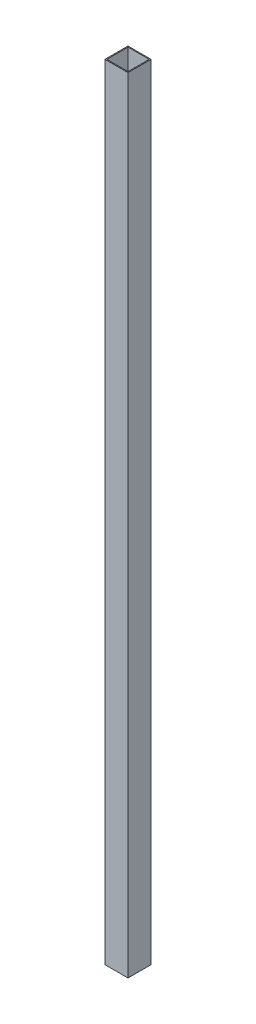
ISO-10303-21;
HEADER;
FILE_DESCRIPTION(('STEP AP214'),'2;1');
FILE_NAME('part.step','',(''),(''),'','','');
FILE_SCHEMA(('AUTOMOTIVE_DESIGN { 1 0 10303 214 1 1 1 1 }'));
ENDSEC;
DATA;
#1=APPLICATION_CONTEXT('core data for automotive mechanical design processes');
#2=APPLICATION_PROTOCOL_DEFINITION('international standard','automotive_design',2000,#1);
#3=PRODUCT_CONTEXT('',#1,'mechanical');
#4=PRODUCT('Part','Part','',(#3));
#5=PRODUCT_RELATED_PRODUCT_CATEGORY('part','',(#4));
#6=PRODUCT_DEFINITION_FORMATION('','',#4);
#7=PRODUCT_DEFINITION_CONTEXT('part definition',#1,'design');
#8=PRODUCT_DEFINITION('design','',#6,#7);
#9=PRODUCT_DEFINITION_SHAPE('','',#8);
#10=(LENGTH_UNIT() NAMED_UNIT(*) SI_UNIT(.MILLI.,.METRE.));
#11=(NAMED_UNIT(*) PLANE_ANGLE_UNIT() SI_UNIT($,.RADIAN.));
#12=(NAMED_UNIT(*) SI_UNIT($,.STERADIAN.) SOLID_ANGLE_UNIT());
#13=UNCERTAINTY_MEASURE_WITH_UNIT(LENGTH_MEASURE(1.E-05),#10,'distance_accuracy_value','');
#14=(GEOMETRIC_REPRESENTATION_CONTEXT(3) GLOBAL_UNCERTAINTY_ASSIGNED_CONTEXT((#13)) GLOBAL_UNIT_ASSIGNED_CONTEXT((#10,
#11,#12)) REPRESENTATION_CONTEXT('',''));
#15=CARTESIAN_POINT('',(0.,0.,0.));
#16=DIRECTION('',(0.,0.,1.));
#17=DIRECTION('',(1.,0.,0.));
#18=AXIS2_PLACEMENT_3D('',#15,#16,#17);
#19=CARTESIAN_POINT('',(0.,1700.,0.));
#20=DIRECTION('',(0.,-1.,0.));
#21=DIRECTION('',(0.,0.,-1.));
#22=AXIS2_PLACEMENT_3D('',#19,#20,#21);
#23=PLANE('',#22);
#24=DIRECTION('',(0.,0.,-1.));
#25=VECTOR('',#24,1.);
#26=CARTESIAN_POINT('',(25.,1700.,25.));
#27=LINE('',#26,#25);
#28=CARTESIAN_POINT('',(25.,1700.,25.));
#29=VERTEX_POINT('',#28);
#30=CARTESIAN_POINT('',(25.,1700.,-25.));
#31=VERTEX_POINT('',#30);
#32=EDGE_CURVE('E153',#29,#31,#27,.T.);
#33=ORIENTED_EDGE('',*,*,#32,.T.);
#34=DIRECTION('',(-1.,0.,0.));
#35=VECTOR('',#34,1.);
#36=CARTESIAN_POINT('',(-25.,1700.,-25.));
#37=LINE('',#36,#35);
#38=CARTESIAN_POINT('',(-25.,1700.,-25.));
#39=VERTEX_POINT('',#38);
#40=EDGE_CURVE('E157',#31,#39,#37,.T.);
#41=ORIENTED_EDGE('',*,*,#40,.T.);
#42=DIRECTION('',(0.,0.,1.));
#43=VECTOR('',#42,1.);
#44=CARTESIAN_POINT('',(-25.,1700.,25.));
#45=LINE('',#44,#43);
#46=CARTESIAN_POINT('',(-25.,1700.,25.));
#47=VERTEX_POINT('',#46);
#48=EDGE_CURVE('E161',#39,#47,#45,.T.);
#49=ORIENTED_EDGE('',*,*,#48,.T.);
#50=DIRECTION('',(1.,0.,0.));
#51=VECTOR('',#50,1.);
#52=CARTESIAN_POINT('',(-25.,1700.,25.));
#53=LINE('',#52,#51);
#54=EDGE_CURVE('E164',#47,#29,#53,.T.);
#55=ORIENTED_EDGE('',*,*,#54,.T.);
#56=EDGE_LOOP('',(#33,#41,#49,#55));
#57=FACE_BOUND('',#56,.T.);
#58=DIRECTION('',(0.,0.,1.));
#59=VECTOR('',#58,1.);
#60=CARTESIAN_POINT('',(-23.,1700.,23.));
#61=LINE('',#60,#59);
#62=CARTESIAN_POINT('',(-23.,1700.,-23.));
#63=VERTEX_POINT('',#62);
#64=CARTESIAN_POINT('',(-23.,1700.,23.));
#65=VERTEX_POINT('',#64);
#66=EDGE_CURVE('E105',#63,#65,#61,.T.);
#67=ORIENTED_EDGE('',*,*,#66,.F.);
#68=DIRECTION('',(-1.,0.,0.));
#69=VECTOR('',#68,1.);
#70=CARTESIAN_POINT('',(-23.,1700.,-23.));
#71=LINE('',#70,#69);
#72=CARTESIAN_POINT('',(23.,1700.,-23.));
#73=VERTEX_POINT('',#72);
#74=EDGE_CURVE('E131',#73,#63,#71,.T.);
#75=ORIENTED_EDGE('',*,*,#74,.F.);
#76=DIRECTION('',(0.,0.,-1.));
#77=VECTOR('',#76,1.);
#78=CARTESIAN_POINT('',(23.,1700.,23.));
#79=LINE('',#78,#77);
#80=CARTESIAN_POINT('',(23.,1700.,23.));
#81=VERTEX_POINT('',#80);
#82=EDGE_CURVE('E127',#81,#73,#79,.T.);
#83=ORIENTED_EDGE('',*,*,#82,.F.);
#84=DIRECTION('',(1.,0.,0.));
#85=VECTOR('',#84,1.);
#86=CARTESIAN_POINT('',(-23.,1700.,23.));
#87=LINE('',#86,#85);
#88=EDGE_CURVE('E114',#65,#81,#87,.T.);
#89=ORIENTED_EDGE('',*,*,#88,.F.);
#90=EDGE_LOOP('',(#67,#75,#83,#89));
#91=FACE_BOUND('',#90,.T.);
#92=ADVANCED_FACE('F39',(#57,#91),#23,.F.);
#93=CARTESIAN_POINT('',(0.,0.,0.));
#94=DIRECTION('',(0.,-1.,0.));
#95=DIRECTION('',(0.,0.,-1.));
#96=AXIS2_PLACEMENT_3D('',#93,#94,#95);
#97=PLANE('',#96);
#98=DIRECTION('',(0.,0.,-1.));
#99=VECTOR('',#98,1.);
#100=CARTESIAN_POINT('',(25.,0.,25.));
#101=LINE('',#100,#99);
#102=CARTESIAN_POINT('',(25.,0.,25.));
#103=VERTEX_POINT('',#102);
#104=CARTESIAN_POINT('',(25.,0.,-25.));
#105=VERTEX_POINT('',#104);
#106=EDGE_CURVE('E123',#103,#105,#101,.T.);
#107=ORIENTED_EDGE('',*,*,#106,.F.);
#108=DIRECTION('',(1.,0.,0.));
#109=VECTOR('',#108,1.);
#110=CARTESIAN_POINT('',(-25.,0.,25.));
#111=LINE('',#110,#109);
#112=CARTESIAN_POINT('',(-25.,0.,25.));
#113=VERTEX_POINT('',#112);
#114=EDGE_CURVE('E158',#113,#103,#111,.T.);
#115=ORIENTED_EDGE('',*,*,#114,.F.);
#116=DIRECTION('',(0.,0.,1.));
#117=VECTOR('',#116,1.);
#118=CARTESIAN_POINT('',(-25.,0.,25.));
#119=LINE('',#118,#117);
#120=CARTESIAN_POINT('',(-25.,0.,-25.));
#121=VERTEX_POINT('',#120);
#122=EDGE_CURVE('E174',#121,#113,#119,.T.);
#123=ORIENTED_EDGE('',*,*,#122,.F.);
#124=DIRECTION('',(-1.,0.,0.));
#125=VECTOR('',#124,1.);
#126=CARTESIAN_POINT('',(-25.,0.,-25.));
#127=LINE('',#126,#125);
#128=EDGE_CURVE('E171',#105,#121,#127,.T.);
#129=ORIENTED_EDGE('',*,*,#128,.F.);
#130=EDGE_LOOP('',(#107,#115,#123,#129));
#131=FACE_BOUND('',#130,.T.);
#132=DIRECTION('',(-1.,0.,0.));
#133=VECTOR('',#132,1.);
#134=CARTESIAN_POINT('',(-23.,0.,-23.));
#135=LINE('',#134,#133);
#136=CARTESIAN_POINT('',(23.,0.,-23.));
#137=VERTEX_POINT('',#136);
#138=CARTESIAN_POINT('',(-23.,0.,-23.));
#139=VERTEX_POINT('',#138);
#140=EDGE_CURVE('E115',#137,#139,#135,.T.);
#141=ORIENTED_EDGE('',*,*,#140,.T.);
#142=DIRECTION('',(0.,0.,1.));
#143=VECTOR('',#142,1.);
#144=CARTESIAN_POINT('',(-23.,0.,23.));
#145=LINE('',#144,#143);
#146=CARTESIAN_POINT('',(-23.,0.,23.));
#147=VERTEX_POINT('',#146);
#148=EDGE_CURVE('E63',#139,#147,#145,.T.);
#149=ORIENTED_EDGE('',*,*,#148,.T.);
#150=DIRECTION('',(1.,0.,0.));
#151=VECTOR('',#150,1.);
#152=CARTESIAN_POINT('',(-23.,0.,23.));
#153=LINE('',#152,#151);
#154=CARTESIAN_POINT('',(23.,0.,23.));
#155=VERTEX_POINT('',#154);
#156=EDGE_CURVE('E121',#147,#155,#153,.T.);
#157=ORIENTED_EDGE('',*,*,#156,.T.);
#158=DIRECTION('',(0.,0.,-1.));
#159=VECTOR('',#158,1.);
#160=CARTESIAN_POINT('',(23.,0.,23.));
#161=LINE('',#160,#159);
#162=EDGE_CURVE('E140',#155,#137,#161,.T.);
#163=ORIENTED_EDGE('',*,*,#162,.T.);
#164=EDGE_LOOP('',(#141,#149,#157,#163));
#165=FACE_BOUND('',#164,.T.);
#166=ADVANCED_FACE('F197',(#131,#165),#97,.T.);
#167=CARTESIAN_POINT('',(25.,1700.,25.));
#168=DIRECTION('',(-1.,0.,0.));
#169=DIRECTION('',(0.,0.,1.));
#170=AXIS2_PLACEMENT_3D('',#167,#168,#169);
#171=PLANE('',#170);
#172=ORIENTED_EDGE('',*,*,#106,.T.);
#173=DIRECTION('',(0.,-1.,0.));
#174=VECTOR('',#173,1.);
#175=CARTESIAN_POINT('',(25.,1700.,-25.));
#176=LINE('',#175,#174);
#177=EDGE_CURVE('E11',#31,#105,#176,.T.);
#178=ORIENTED_EDGE('',*,*,#177,.F.);
#179=ORIENTED_EDGE('',*,*,#32,.F.);
#180=DIRECTION('',(0.,-1.,0.));
#181=VECTOR('',#180,1.);
#182=CARTESIAN_POINT('',(25.,1700.,25.));
#183=LINE('',#182,#181);
#184=EDGE_CURVE('E167',#29,#103,#183,.T.);
#185=ORIENTED_EDGE('',*,*,#184,.T.);
#186=EDGE_LOOP('',(#172,#178,#179,#185));
#187=FACE_BOUND('',#186,.T.);
#188=ADVANCED_FACE('F41',(#187),#171,.F.);
#189=CARTESIAN_POINT('',(-25.,1700.,-25.));
#190=DIRECTION('',(0.,0.,1.));
#191=DIRECTION('',(1.,0.,0.));
#192=AXIS2_PLACEMENT_3D('',#189,#190,#191);
#193=PLANE('',#192);
#194=ORIENTED_EDGE('',*,*,#128,.T.);
#195=DIRECTION('',(0.,-1.,0.));
#196=VECTOR('',#195,1.);
#197=CARTESIAN_POINT('',(-25.,1700.,-25.));
#198=LINE('',#197,#196);
#199=EDGE_CURVE('E48',#39,#121,#198,.T.);
#200=ORIENTED_EDGE('',*,*,#199,.F.);
#201=ORIENTED_EDGE('',*,*,#40,.F.);
#202=ORIENTED_EDGE('',*,*,#177,.T.);
#203=EDGE_LOOP('',(#194,#200,#201,#202));
#204=FACE_BOUND('',#203,.T.);
#205=ADVANCED_FACE('F207',(#204),#193,.F.);
#206=CARTESIAN_POINT('',(-25.,1700.,25.));
#207=DIRECTION('',(1.,0.,0.));
#208=DIRECTION('',(0.,0.,-1.));
#209=AXIS2_PLACEMENT_3D('',#206,#207,#208);
#210=PLANE('',#209);
#211=ORIENTED_EDGE('',*,*,#122,.T.);
#212=DIRECTION('',(0.,-1.,0.));
#213=VECTOR('',#212,1.);
#214=CARTESIAN_POINT('',(-25.,1700.,25.));
#215=LINE('',#214,#213);
#216=EDGE_CURVE('E182',#47,#113,#215,.T.);
#217=ORIENTED_EDGE('',*,*,#216,.F.);
#218=ORIENTED_EDGE('',*,*,#48,.F.);
#219=ORIENTED_EDGE('',*,*,#199,.T.);
#220=EDGE_LOOP('',(#211,#217,#218,#219));
#221=FACE_BOUND('',#220,.T.);
#222=ADVANCED_FACE('F191',(#221),#210,.F.);
#223=CARTESIAN_POINT('',(-25.,1700.,25.));
#224=DIRECTION('',(0.,0.,-1.));
#225=DIRECTION('',(-1.,0.,0.));
#226=AXIS2_PLACEMENT_3D('',#223,#224,#225);
#227=PLANE('',#226);
#228=ORIENTED_EDGE('',*,*,#114,.T.);
#229=ORIENTED_EDGE('',*,*,#184,.F.);
#230=ORIENTED_EDGE('',*,*,#54,.F.);
#231=ORIENTED_EDGE('',*,*,#216,.T.);
#232=EDGE_LOOP('',(#228,#229,#230,#231));
#233=FACE_BOUND('',#232,.T.);
#234=ADVANCED_FACE('F201',(#233),#227,.F.);
#235=CARTESIAN_POINT('',(-23.,1700.,23.));
#236=DIRECTION('',(1.,0.,0.));
#237=DIRECTION('',(0.,0.,-1.));
#238=AXIS2_PLACEMENT_3D('',#235,#236,#237);
#239=PLANE('',#238);
#240=ORIENTED_EDGE('',*,*,#148,.F.);
#241=DIRECTION('',(0.,-1.,0.));
#242=VECTOR('',#241,1.);
#243=CARTESIAN_POINT('',(-23.,1700.,-23.));
#244=LINE('',#243,#242);
#245=EDGE_CURVE('E109',#63,#139,#244,.T.);
#246=ORIENTED_EDGE('',*,*,#245,.F.);
#247=ORIENTED_EDGE('',*,*,#66,.T.);
#248=DIRECTION('',(0.,-1.,0.));
#249=VECTOR('',#248,1.);
#250=CARTESIAN_POINT('',(-23.,1700.,23.));
#251=LINE('',#250,#249);
#252=EDGE_CURVE('E108',#65,#147,#251,.T.);
#253=ORIENTED_EDGE('',*,*,#252,.T.);
#254=EDGE_LOOP('',(#240,#246,#247,#253));
#255=FACE_BOUND('',#254,.T.);
#256=ADVANCED_FACE('F107',(#255),#239,.T.);
#257=CARTESIAN_POINT('',(-23.,1700.,23.));
#258=DIRECTION('',(0.,0.,-1.));
#259=DIRECTION('',(-1.,0.,0.));
#260=AXIS2_PLACEMENT_3D('',#257,#258,#259);
#261=PLANE('',#260);
#262=ORIENTED_EDGE('',*,*,#156,.F.);
#263=ORIENTED_EDGE('',*,*,#252,.F.);
#264=ORIENTED_EDGE('',*,*,#88,.T.);
#265=DIRECTION('',(0.,-1.,0.));
#266=VECTOR('',#265,1.);
#267=CARTESIAN_POINT('',(23.,1700.,23.));
#268=LINE('',#267,#266);
#269=EDGE_CURVE('E124',#81,#155,#268,.T.);
#270=ORIENTED_EDGE('',*,*,#269,.T.);
#271=EDGE_LOOP('',(#262,#263,#264,#270));
#272=FACE_BOUND('',#271,.T.);
#273=ADVANCED_FACE('F118',(#272),#261,.T.);
#274=CARTESIAN_POINT('',(23.,1700.,23.));
#275=DIRECTION('',(-1.,0.,0.));
#276=DIRECTION('',(0.,0.,1.));
#277=AXIS2_PLACEMENT_3D('',#274,#275,#276);
#278=PLANE('',#277);
#279=ORIENTED_EDGE('',*,*,#162,.F.);
#280=ORIENTED_EDGE('',*,*,#269,.F.);
#281=ORIENTED_EDGE('',*,*,#82,.T.);
#282=DIRECTION('',(0.,-1.,0.));
#283=VECTOR('',#282,1.);
#284=CARTESIAN_POINT('',(23.,1700.,-23.));
#285=LINE('',#284,#283);
#286=EDGE_CURVE('E55',#73,#137,#285,.T.);
#287=ORIENTED_EDGE('',*,*,#286,.T.);
#288=EDGE_LOOP('',(#279,#280,#281,#287));
#289=FACE_BOUND('',#288,.T.);
#290=ADVANCED_FACE('F230',(#289),#278,.T.);
#291=CARTESIAN_POINT('',(-23.,1700.,-23.));
#292=DIRECTION('',(0.,0.,1.));
#293=DIRECTION('',(1.,0.,0.));
#294=AXIS2_PLACEMENT_3D('',#291,#292,#293);
#295=PLANE('',#294);
#296=ORIENTED_EDGE('',*,*,#140,.F.);
#297=ORIENTED_EDGE('',*,*,#286,.F.);
#298=ORIENTED_EDGE('',*,*,#74,.T.);
#299=ORIENTED_EDGE('',*,*,#245,.T.);
#300=EDGE_LOOP('',(#296,#297,#298,#299));
#301=FACE_BOUND('',#300,.T.);
#302=ADVANCED_FACE('F234',(#301),#295,.T.);
#303=CLOSED_SHELL('',(#92,#166,#188,#205,#222,#234,#256,#273,#290,#302));
#304=MANIFOLD_SOLID_BREP('B2',#303);
#305=ADVANCED_BREP_SHAPE_REPRESENTATION('',(#18,#304),#14);
#306=SHAPE_DEFINITION_REPRESENTATION(#9,#305);
ENDSEC;
END-ISO-10303-21;
